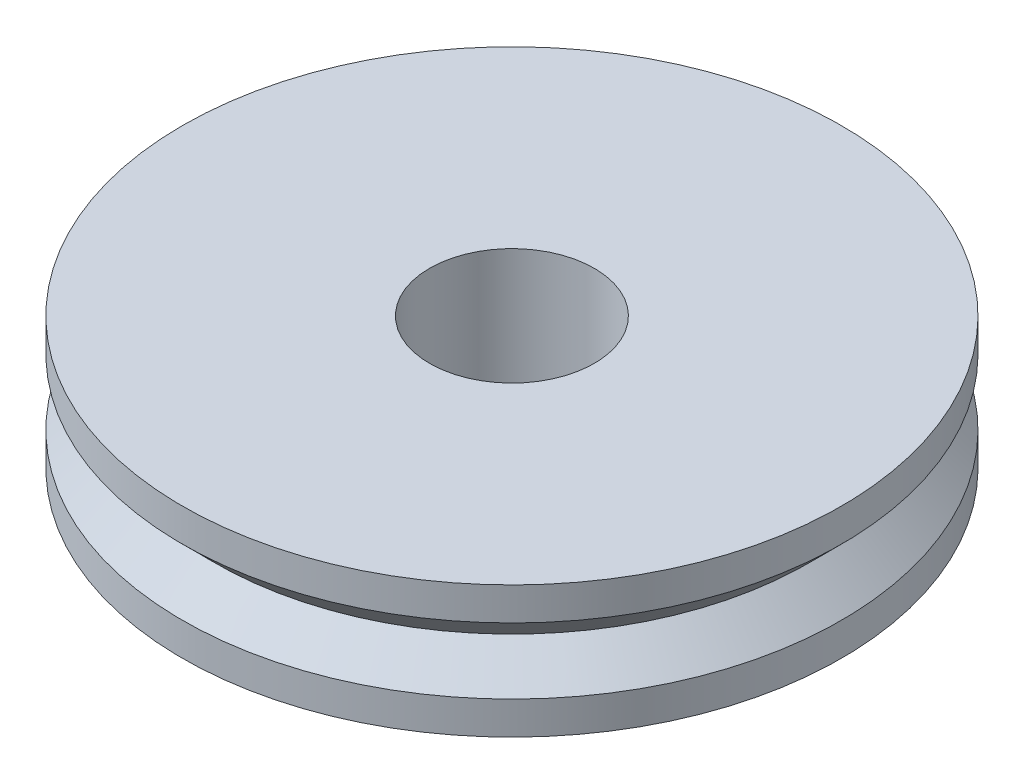
ISO-10303-21;
HEADER;
FILE_DESCRIPTION(('STEP AP214'),'2;1');
FILE_NAME('part.step','',(''),(''),'','','');
FILE_SCHEMA(('AUTOMOTIVE_DESIGN { 1 0 10303 214 1 1 1 1 }'));
ENDSEC;
DATA;
#1=APPLICATION_CONTEXT('core data for automotive mechanical design processes');
#2=APPLICATION_PROTOCOL_DEFINITION('international standard','automotive_design',2000,#1);
#3=PRODUCT_CONTEXT('',#1,'mechanical');
#4=PRODUCT('Part','Part','',(#3));
#5=PRODUCT_RELATED_PRODUCT_CATEGORY('part','',(#4));
#6=PRODUCT_DEFINITION_FORMATION('','',#4);
#7=PRODUCT_DEFINITION_CONTEXT('part definition',#1,'design');
#8=PRODUCT_DEFINITION('design','',#6,#7);
#9=PRODUCT_DEFINITION_SHAPE('','',#8);
#10=(LENGTH_UNIT() NAMED_UNIT(*) SI_UNIT(.MILLI.,.METRE.));
#11=(NAMED_UNIT(*) PLANE_ANGLE_UNIT() SI_UNIT($,.RADIAN.));
#12=(NAMED_UNIT(*) SI_UNIT($,.STERADIAN.) SOLID_ANGLE_UNIT());
#13=UNCERTAINTY_MEASURE_WITH_UNIT(LENGTH_MEASURE(1.E-05),#10,'distance_accuracy_value','');
#14=(GEOMETRIC_REPRESENTATION_CONTEXT(3) GLOBAL_UNCERTAINTY_ASSIGNED_CONTEXT((#13)) GLOBAL_UNIT_ASSIGNED_CONTEXT((#10,
#11,#12)) REPRESENTATION_CONTEXT('',''));
#15=CARTESIAN_POINT('',(0.,0.,0.));
#16=DIRECTION('',(0.,0.,1.));
#17=DIRECTION('',(1.,0.,0.));
#18=AXIS2_PLACEMENT_3D('',#15,#16,#17);
#19=CARTESIAN_POINT('',(0.,2.,0.));
#20=DIRECTION('',(0.,1.,0.));
#21=DIRECTION('',(-1.,0.,0.));
#22=AXIS2_PLACEMENT_3D('',#19,#20,#21);
#23=CONICAL_SURFACE('',#22,9.,0.785398163397448);
#24=CARTESIAN_POINT('',(0.,3.,0.));
#25=DIRECTION('',(0.,1.,0.));
#26=DIRECTION('',(-1.,0.,0.));
#27=AXIS2_PLACEMENT_3D('',#24,#25,#26);
#28=CIRCLE('',#27,10.);
#29=CARTESIAN_POINT('',(-10.,3.,0.));
#30=VERTEX_POINT('',#29);
#31=EDGE_CURVE('E10',#30,#30,#28,.T.);
#32=ORIENTED_EDGE('',*,*,#31,.F.);
#33=EDGE_LOOP('',(#32));
#34=FACE_BOUND('',#33,.T.);
#35=CARTESIAN_POINT('',(0.,2.,0.));
#36=DIRECTION('',(0.,1.,0.));
#37=DIRECTION('',(-1.,0.,0.));
#38=AXIS2_PLACEMENT_3D('',#35,#36,#37);
#39=CIRCLE('',#38,9.);
#40=CARTESIAN_POINT('',(-9.,2.,0.));
#41=VERTEX_POINT('',#40);
#42=EDGE_CURVE('E56',#41,#41,#39,.T.);
#43=ORIENTED_EDGE('',*,*,#42,.T.);
#44=EDGE_LOOP('',(#43));
#45=FACE_BOUND('',#44,.T.);
#46=ADVANCED_FACE('F31',(#34,#45),#23,.T.);
#47=CARTESIAN_POINT('',(0.,15.5255745467289,0.));
#48=DIRECTION('',(0.,1.,0.));
#49=DIRECTION('',(-1.,0.,0.));
#50=AXIS2_PLACEMENT_3D('',#47,#48,#49);
#51=CYLINDRICAL_SURFACE('',#50,10.);
#52=CARTESIAN_POINT('',(0.,4.,0.));
#53=DIRECTION('',(0.,1.,0.));
#54=DIRECTION('',(-1.,0.,0.));
#55=AXIS2_PLACEMENT_3D('',#52,#53,#54);
#56=CIRCLE('',#55,10.);
#57=CARTESIAN_POINT('',(-10.,4.,0.));
#58=VERTEX_POINT('',#57);
#59=EDGE_CURVE('E37',#58,#58,#56,.T.);
#60=ORIENTED_EDGE('',*,*,#59,.F.);
#61=EDGE_LOOP('',(#60));
#62=FACE_BOUND('',#61,.T.);
#63=ORIENTED_EDGE('',*,*,#31,.T.);
#64=EDGE_LOOP('',(#63));
#65=FACE_BOUND('',#64,.T.);
#66=ADVANCED_FACE('F87',(#62,#65),#51,.T.);
#67=CARTESIAN_POINT('',(10.,4.,0.));
#68=DIRECTION('',(0.,-1.,0.));
#69=DIRECTION('',(1.,0.,0.));
#70=AXIS2_PLACEMENT_3D('',#67,#68,#69);
#71=PLANE('',#70);
#72=CARTESIAN_POINT('',(0.,4.,0.));
#73=DIRECTION('',(0.,1.,0.));
#74=DIRECTION('',(-1.,0.,0.));
#75=AXIS2_PLACEMENT_3D('',#72,#73,#74);
#76=CIRCLE('',#75,2.5);
#77=CARTESIAN_POINT('',(-2.5,4.,0.));
#78=VERTEX_POINT('',#77);
#79=EDGE_CURVE('E41',#78,#78,#76,.T.);
#80=ORIENTED_EDGE('',*,*,#79,.F.);
#81=EDGE_LOOP('',(#80));
#82=FACE_BOUND('',#81,.T.);
#83=ORIENTED_EDGE('',*,*,#59,.T.);
#84=EDGE_LOOP('',(#83));
#85=FACE_BOUND('',#84,.T.);
#86=ADVANCED_FACE('F82',(#82,#85),#71,.F.);
#87=CARTESIAN_POINT('',(0.,15.5255745467289,0.));
#88=DIRECTION('',(0.,1.,0.));
#89=DIRECTION('',(-1.,0.,0.));
#90=AXIS2_PLACEMENT_3D('',#87,#88,#89);
#91=CYLINDRICAL_SURFACE('',#90,2.5);
#92=CARTESIAN_POINT('',(0.,0.,0.));
#93=DIRECTION('',(0.,1.,0.));
#94=DIRECTION('',(-1.,0.,0.));
#95=AXIS2_PLACEMENT_3D('',#92,#93,#94);
#96=CIRCLE('',#95,2.5);
#97=CARTESIAN_POINT('',(-2.5,0.,0.));
#98=VERTEX_POINT('',#97);
#99=EDGE_CURVE('E45',#98,#98,#96,.T.);
#100=ORIENTED_EDGE('',*,*,#99,.F.);
#101=EDGE_LOOP('',(#100));
#102=FACE_BOUND('',#101,.T.);
#103=ORIENTED_EDGE('',*,*,#79,.T.);
#104=EDGE_LOOP('',(#103));
#105=FACE_BOUND('',#104,.T.);
#106=ADVANCED_FACE('F76',(#102,#105),#91,.F.);
#107=CARTESIAN_POINT('',(10.,0.,0.));
#108=DIRECTION('',(0.,1.,0.));
#109=DIRECTION('',(-1.,0.,0.));
#110=AXIS2_PLACEMENT_3D('',#107,#108,#109);
#111=PLANE('',#110);
#112=CARTESIAN_POINT('',(0.,0.,0.));
#113=DIRECTION('',(0.,1.,0.));
#114=DIRECTION('',(-1.,0.,0.));
#115=AXIS2_PLACEMENT_3D('',#112,#113,#114);
#116=CIRCLE('',#115,10.);
#117=CARTESIAN_POINT('',(-10.,0.,0.));
#118=VERTEX_POINT('',#117);
#119=EDGE_CURVE('E50',#118,#118,#116,.T.);
#120=ORIENTED_EDGE('',*,*,#119,.F.);
#121=EDGE_LOOP('',(#120));
#122=FACE_BOUND('',#121,.T.);
#123=ORIENTED_EDGE('',*,*,#99,.T.);
#124=EDGE_LOOP('',(#123));
#125=FACE_BOUND('',#124,.T.);
#126=ADVANCED_FACE('F70',(#122,#125),#111,.F.);
#127=CARTESIAN_POINT('',(0.,15.5255745467289,0.));
#128=DIRECTION('',(0.,1.,0.));
#129=DIRECTION('',(-1.,0.,0.));
#130=AXIS2_PLACEMENT_3D('',#127,#128,#129);
#131=CYLINDRICAL_SURFACE('',#130,10.);
#132=CARTESIAN_POINT('',(0.,0.999999999999999,0.));
#133=DIRECTION('',(0.,1.,0.));
#134=DIRECTION('',(-1.,0.,0.));
#135=AXIS2_PLACEMENT_3D('',#132,#133,#134);
#136=CIRCLE('',#135,10.);
#137=CARTESIAN_POINT('',(-10.,0.999999999999998,0.));
#138=VERTEX_POINT('',#137);
#139=EDGE_CURVE('E53',#138,#138,#136,.T.);
#140=ORIENTED_EDGE('',*,*,#139,.F.);
#141=EDGE_LOOP('',(#140));
#142=FACE_BOUND('',#141,.T.);
#143=ORIENTED_EDGE('',*,*,#119,.T.);
#144=EDGE_LOOP('',(#143));
#145=FACE_BOUND('',#144,.T.);
#146=ADVANCED_FACE('F64',(#142,#145),#131,.T.);
#147=CARTESIAN_POINT('',(0.,0.999999999999999,0.));
#148=DIRECTION('',(0.,-1.,0.));
#149=DIRECTION('',(1.,0.,0.));
#150=AXIS2_PLACEMENT_3D('',#147,#148,#149);
#151=CONICAL_SURFACE('',#150,10.,0.785398163397449);
#152=ORIENTED_EDGE('',*,*,#42,.F.);
#153=EDGE_LOOP('',(#152));
#154=FACE_BOUND('',#153,.T.);
#155=ORIENTED_EDGE('',*,*,#139,.T.);
#156=EDGE_LOOP('',(#155));
#157=FACE_BOUND('',#156,.T.);
#158=ADVANCED_FACE('F61',(#154,#157),#151,.T.);
#159=CLOSED_SHELL('',(#46,#66,#86,#106,#126,#146,#158));
#160=MANIFOLD_SOLID_BREP('B2',#159);
#161=ADVANCED_BREP_SHAPE_REPRESENTATION('',(#18,#160),#14);
#162=SHAPE_DEFINITION_REPRESENTATION(#9,#161);
ENDSEC;
END-ISO-10303-21;
